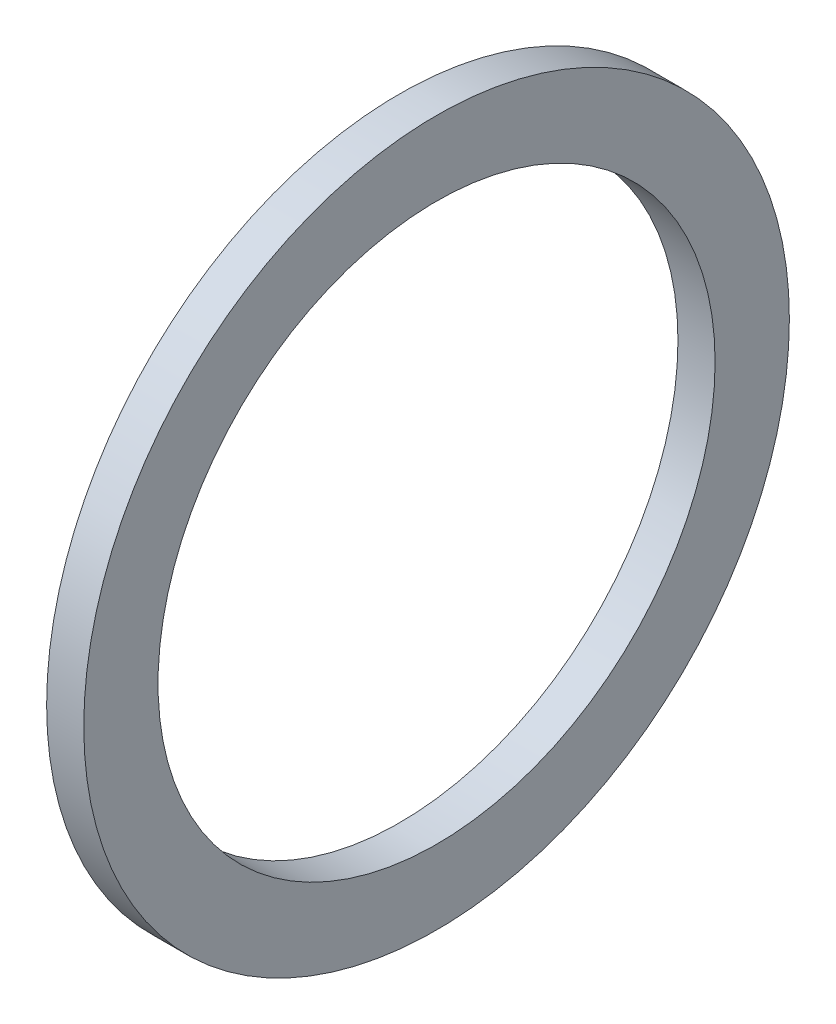
ISO-10303-21;
HEADER;
FILE_DESCRIPTION(('STEP AP214'),'2;1');
FILE_NAME('part.step','',(''),(''),'','','');
FILE_SCHEMA(('AUTOMOTIVE_DESIGN { 1 0 10303 214 1 1 1 1 }'));
ENDSEC;
DATA;
#1=APPLICATION_CONTEXT('core data for automotive mechanical design processes');
#2=APPLICATION_PROTOCOL_DEFINITION('international standard','automotive_design',2000,#1);
#3=PRODUCT_CONTEXT('',#1,'mechanical');
#4=PRODUCT('Part','Part','',(#3));
#5=PRODUCT_RELATED_PRODUCT_CATEGORY('part','',(#4));
#6=PRODUCT_DEFINITION_FORMATION('','',#4);
#7=PRODUCT_DEFINITION_CONTEXT('part definition',#1,'design');
#8=PRODUCT_DEFINITION('design','',#6,#7);
#9=PRODUCT_DEFINITION_SHAPE('','',#8);
#10=(LENGTH_UNIT() NAMED_UNIT(*) SI_UNIT(.MILLI.,.METRE.));
#11=(NAMED_UNIT(*) PLANE_ANGLE_UNIT() SI_UNIT($,.RADIAN.));
#12=(NAMED_UNIT(*) SI_UNIT($,.STERADIAN.) SOLID_ANGLE_UNIT());
#13=UNCERTAINTY_MEASURE_WITH_UNIT(LENGTH_MEASURE(1.E-05),#10,'distance_accuracy_value','');
#14=(GEOMETRIC_REPRESENTATION_CONTEXT(3) GLOBAL_UNCERTAINTY_ASSIGNED_CONTEXT((#13)) GLOBAL_UNIT_ASSIGNED_CONTEXT((#10,
#11,#12)) REPRESENTATION_CONTEXT('',''));
#15=CARTESIAN_POINT('',(0.,0.,0.));
#16=DIRECTION('',(0.,0.,1.));
#17=DIRECTION('',(1.,0.,0.));
#18=AXIS2_PLACEMENT_3D('',#15,#16,#17);
#19=CARTESIAN_POINT('',(5.,0.,0.));
#20=DIRECTION('',(1.,0.,0.));
#21=DIRECTION('',(0.,0.,-1.));
#22=AXIS2_PLACEMENT_3D('',#19,#20,#21);
#23=PLANE('',#22);
#24=CARTESIAN_POINT('',(5.,0.,0.));
#25=DIRECTION('',(1.,0.,0.));
#26=DIRECTION('',(0.,0.,-1.));
#27=AXIS2_PLACEMENT_3D('',#24,#25,#26);
#28=CIRCLE('',#27,47.5);
#29=CARTESIAN_POINT('',(5.,0.,-47.5));
#30=VERTEX_POINT('',#29);
#31=EDGE_CURVE('E10',#30,#30,#28,.T.);
#32=ORIENTED_EDGE('',*,*,#31,.T.);
#33=EDGE_LOOP('',(#32));
#34=FACE_BOUND('',#33,.T.);
#35=CARTESIAN_POINT('',(5.,0.,0.));
#36=DIRECTION('',(1.,0.,0.));
#37=DIRECTION('',(0.,0.,-1.));
#38=AXIS2_PLACEMENT_3D('',#35,#36,#37);
#39=CIRCLE('',#38,37.5);
#40=CARTESIAN_POINT('',(5.,0.,-37.5));
#41=VERTEX_POINT('',#40);
#42=EDGE_CURVE('E48',#41,#41,#39,.T.);
#43=ORIENTED_EDGE('',*,*,#42,.F.);
#44=EDGE_LOOP('',(#43));
#45=FACE_BOUND('',#44,.T.);
#46=ADVANCED_FACE('F37',(#34,#45),#23,.T.);
#47=CARTESIAN_POINT('',(0.,0.,0.));
#48=DIRECTION('',(1.,0.,0.));
#49=DIRECTION('',(0.,0.,-1.));
#50=AXIS2_PLACEMENT_3D('',#47,#48,#49);
#51=PLANE('',#50);
#52=CARTESIAN_POINT('',(0.,0.,0.));
#53=DIRECTION('',(1.,0.,0.));
#54=DIRECTION('',(0.,0.,-1.));
#55=AXIS2_PLACEMENT_3D('',#52,#53,#54);
#56=CIRCLE('',#55,47.5);
#57=CARTESIAN_POINT('',(0.,0.,-47.5));
#58=VERTEX_POINT('',#57);
#59=EDGE_CURVE('E41',#58,#58,#56,.T.);
#60=ORIENTED_EDGE('',*,*,#59,.F.);
#61=EDGE_LOOP('',(#60));
#62=FACE_BOUND('',#61,.T.);
#63=CARTESIAN_POINT('',(0.,0.,0.));
#64=DIRECTION('',(1.,0.,0.));
#65=DIRECTION('',(0.,0.,-1.));
#66=AXIS2_PLACEMENT_3D('',#63,#64,#65);
#67=CIRCLE('',#66,37.5);
#68=CARTESIAN_POINT('',(0.,0.,-37.5));
#69=VERTEX_POINT('',#68);
#70=EDGE_CURVE('E50',#69,#69,#67,.T.);
#71=ORIENTED_EDGE('',*,*,#70,.T.);
#72=EDGE_LOOP('',(#71));
#73=FACE_BOUND('',#72,.T.);
#74=ADVANCED_FACE('F60',(#62,#73),#51,.F.);
#75=CARTESIAN_POINT('',(5.,0.,0.));
#76=DIRECTION('',(-1.,0.,0.));
#77=DIRECTION('',(0.,0.,1.));
#78=AXIS2_PLACEMENT_3D('',#75,#76,#77);
#79=CYLINDRICAL_SURFACE('',#78,47.5);
#80=ORIENTED_EDGE('',*,*,#31,.F.);
#81=EDGE_LOOP('',(#80));
#82=FACE_BOUND('',#81,.T.);
#83=ORIENTED_EDGE('',*,*,#59,.T.);
#84=EDGE_LOOP('',(#83));
#85=FACE_BOUND('',#84,.T.);
#86=ADVANCED_FACE('F39',(#82,#85),#79,.T.);
#87=CARTESIAN_POINT('',(5.,0.,0.));
#88=DIRECTION('',(-1.,0.,0.));
#89=DIRECTION('',(0.,0.,1.));
#90=AXIS2_PLACEMENT_3D('',#87,#88,#89);
#91=CYLINDRICAL_SURFACE('',#90,37.5);
#92=ORIENTED_EDGE('',*,*,#42,.T.);
#93=EDGE_LOOP('',(#92));
#94=FACE_BOUND('',#93,.T.);
#95=ORIENTED_EDGE('',*,*,#70,.F.);
#96=EDGE_LOOP('',(#95));
#97=FACE_BOUND('',#96,.T.);
#98=ADVANCED_FACE('F56',(#94,#97),#91,.F.);
#99=CLOSED_SHELL('',(#46,#74,#86,#98));
#100=MANIFOLD_SOLID_BREP('B2',#99);
#101=ADVANCED_BREP_SHAPE_REPRESENTATION('',(#18,#100),#14);
#102=SHAPE_DEFINITION_REPRESENTATION(#9,#101);
ENDSEC;
END-ISO-10303-21;
